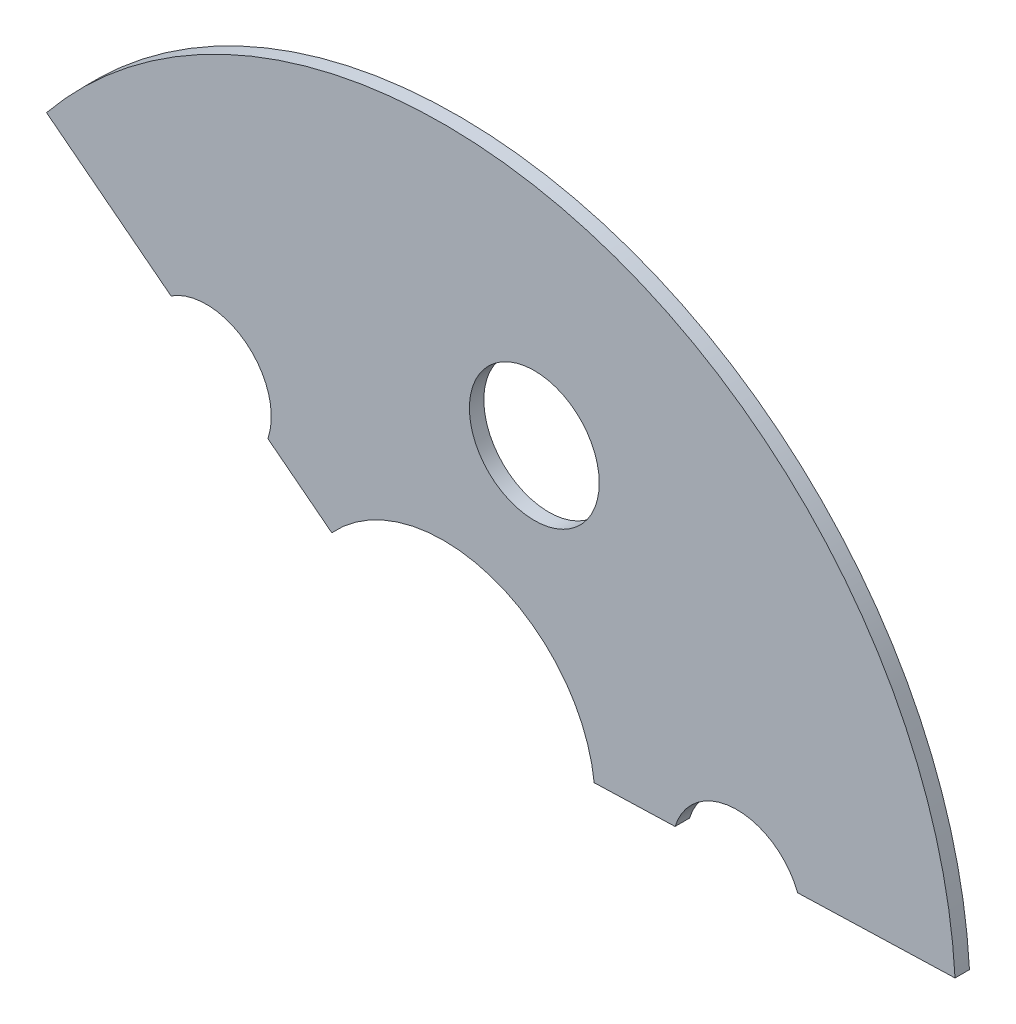
ISO-10303-21;
HEADER;
FILE_DESCRIPTION(('STEP AP214'),'2;1');
FILE_NAME('part.step','',(''),(''),'','','');
FILE_SCHEMA(('AUTOMOTIVE_DESIGN { 1 0 10303 214 1 1 1 1 }'));
ENDSEC;
DATA;
#1=APPLICATION_CONTEXT('core data for automotive mechanical design processes');
#2=APPLICATION_PROTOCOL_DEFINITION('international standard','automotive_design',2000,#1);
#3=PRODUCT_CONTEXT('',#1,'mechanical');
#4=PRODUCT('Part','Part','',(#3));
#5=PRODUCT_RELATED_PRODUCT_CATEGORY('part','',(#4));
#6=PRODUCT_DEFINITION_FORMATION('','',#4);
#7=PRODUCT_DEFINITION_CONTEXT('part definition',#1,'design');
#8=PRODUCT_DEFINITION('design','',#6,#7);
#9=PRODUCT_DEFINITION_SHAPE('','',#8);
#10=(LENGTH_UNIT() NAMED_UNIT(*) SI_UNIT(.MILLI.,.METRE.));
#11=(NAMED_UNIT(*) PLANE_ANGLE_UNIT() SI_UNIT($,.RADIAN.));
#12=(NAMED_UNIT(*) SI_UNIT($,.STERADIAN.) SOLID_ANGLE_UNIT());
#13=UNCERTAINTY_MEASURE_WITH_UNIT(LENGTH_MEASURE(1.E-05),#10,'distance_accuracy_value','');
#14=(GEOMETRIC_REPRESENTATION_CONTEXT(3) GLOBAL_UNCERTAINTY_ASSIGNED_CONTEXT((#13)) GLOBAL_UNIT_ASSIGNED_CONTEXT((#10,
#11,#12)) REPRESENTATION_CONTEXT('',''));
#15=CARTESIAN_POINT('',(0.,0.,0.));
#16=DIRECTION('',(0.,0.,1.));
#17=DIRECTION('',(1.,0.,0.));
#18=AXIS2_PLACEMENT_3D('',#15,#16,#17);
#19=CARTESIAN_POINT('',(45.0166893192371,2.48090865113747,1.27));
#20=DIRECTION('',(-0.0313182896172945,0.999509462053985,0.));
#21=DIRECTION('',(-0.999509462053985,-0.0313182896172945,0.));
#22=AXIS2_PLACEMENT_3D('',#19,#20,#21);
#23=PLANE('',#22);
#24=DIRECTION('',(0.,0.,1.));
#25=VECTOR('',#24,1.);
#26=CARTESIAN_POINT('',(20.3699099311103,1.70863484652068,0.));
#27=LINE('',#26,#25);
#28=CARTESIAN_POINT('',(20.3699099311102,1.70863484652068,0.));
#29=VERTEX_POINT('',#28);
#30=CARTESIAN_POINT('',(20.3699099311103,1.70863484652068,1.27));
#31=VERTEX_POINT('',#30);
#32=EDGE_CURVE('E55',#29,#31,#27,.T.);
#33=ORIENTED_EDGE('',*,*,#32,.T.);
#34=DIRECTION('',(0.999509462053985,0.0313182896172945,0.));
#35=VECTOR('',#34,1.);
#36=CARTESIAN_POINT('',(45.0166893192371,2.48090865113747,1.27));
#37=LINE('',#36,#35);
#38=CARTESIAN_POINT('',(13.2519887109247,1.48560432333908,1.27));
#39=VERTEX_POINT('',#38);
#40=EDGE_CURVE('E195',#39,#31,#37,.T.);
#41=ORIENTED_EDGE('',*,*,#40,.F.);
#42=DIRECTION('',(0.,0.,-1.));
#43=VECTOR('',#42,1.);
#44=CARTESIAN_POINT('',(13.2519887109247,1.48560432333908,1.27));
#45=LINE('',#44,#43);
#46=CARTESIAN_POINT('',(13.2519887109247,1.48560432333908,0.));
#47=VERTEX_POINT('',#46);
#48=EDGE_CURVE('E11',#39,#47,#45,.T.);
#49=ORIENTED_EDGE('',*,*,#48,.T.);
#50=DIRECTION('',(0.999509462053985,0.0313182896172945,0.));
#51=VECTOR('',#50,1.);
#52=CARTESIAN_POINT('',(45.0166893192371,2.48090865113747,0.));
#53=LINE('',#52,#51);
#54=EDGE_CURVE('E134',#47,#29,#53,.T.);
#55=ORIENTED_EDGE('',*,*,#54,.T.);
#56=EDGE_LOOP('',(#33,#41,#49,#55));
#57=FACE_BOUND('',#56,.T.);
#58=ADVANCED_FACE('F39',(#57),#23,.F.);
#59=DIRECTION('',(0.,0.,1.));
#60=VECTOR('',#59,1.);
#61=CARTESIAN_POINT('',(31.159448366082,2.04671057503752,0.));
#62=LINE('',#61,#60);
#63=CARTESIAN_POINT('',(31.159448366082,2.04671057503752,0.));
#64=VERTEX_POINT('',#63);
#65=CARTESIAN_POINT('',(31.159448366082,2.04671057503752,1.27));
#66=VERTEX_POINT('',#65);
#67=EDGE_CURVE('E176',#64,#66,#62,.T.);
#68=ORIENTED_EDGE('',*,*,#67,.F.);
#69=CARTESIAN_POINT('',(45.0166893192371,2.48090865113747,0.));
#70=VERTEX_POINT('',#69);
#71=EDGE_CURVE('E157',#64,#70,#53,.T.);
#72=ORIENTED_EDGE('',*,*,#71,.T.);
#73=DIRECTION('',(0.,0.,-1.));
#74=VECTOR('',#73,1.);
#75=CARTESIAN_POINT('',(45.0166893192371,2.48090865113747,1.27));
#76=LINE('',#75,#74);
#77=CARTESIAN_POINT('',(45.0166893192371,2.48090865113747,1.27));
#78=VERTEX_POINT('',#77);
#79=EDGE_CURVE('E48',#78,#70,#76,.T.);
#80=ORIENTED_EDGE('',*,*,#79,.F.);
#81=EDGE_CURVE('E177',#66,#78,#37,.T.);
#82=ORIENTED_EDGE('',*,*,#81,.F.);
#83=EDGE_LOOP('',(#68,#72,#80,#82));
#84=FACE_BOUND('',#83,.T.);
#85=ADVANCED_FACE('F175',(#84),#23,.F.);
#86=CARTESIAN_POINT('',(-34.9610251723369,28.4672433491412,1.27));
#87=DIRECTION('',(0.612833949857254,0.790211712076173,0.));
#88=DIRECTION('',(-0.790211712076173,0.612833949857254,0.));
#89=AXIS2_PLACEMENT_3D('',#86,#87,#88);
#90=PLANE('',#89);
#91=DIRECTION('',(0.,0.,1.));
#92=VECTOR('',#91,1.);
#93=CARTESIAN_POINT('',(-24.0054969717913,19.9708878569238,0.));
#94=LINE('',#93,#92);
#95=CARTESIAN_POINT('',(-24.0054969717913,19.9708878569238,0.));
#96=VERTEX_POINT('',#95);
#97=CARTESIAN_POINT('',(-24.0054969717913,19.9708878569238,1.27));
#98=VERTEX_POINT('',#97);
#99=EDGE_CURVE('E63',#96,#98,#94,.T.);
#100=ORIENTED_EDGE('',*,*,#99,.T.);
#101=DIRECTION('',(0.790211712076173,-0.612833949857254,0.));
#102=VECTOR('',#101,1.);
#103=CARTESIAN_POINT('',(-34.9610251723369,28.4672433491412,1.27));
#104=LINE('',#103,#102);
#105=CARTESIAN_POINT('',(-34.9610251723369,28.4672433491412,1.27));
#106=VERTEX_POINT('',#105);
#107=EDGE_CURVE('E142',#106,#98,#104,.T.);
#108=ORIENTED_EDGE('',*,*,#107,.F.);
#109=DIRECTION('',(0.,0.,-1.));
#110=VECTOR('',#109,1.);
#111=CARTESIAN_POINT('',(-34.9610251723369,28.4672433491412,1.27));
#112=LINE('',#111,#110);
#113=CARTESIAN_POINT('',(-34.9610251723369,28.4672433491412,0.));
#114=VERTEX_POINT('',#113);
#115=EDGE_CURVE('E141',#106,#114,#112,.T.);
#116=ORIENTED_EDGE('',*,*,#115,.T.);
#117=DIRECTION('',(0.790211712076173,-0.612833949857254,0.));
#118=VECTOR('',#117,1.);
#119=CARTESIAN_POINT('',(-34.9610251723369,28.4672433491412,0.));
#120=LINE('',#119,#118);
#121=EDGE_CURVE('E128',#114,#96,#120,.T.);
#122=ORIENTED_EDGE('',*,*,#121,.T.);
#123=EDGE_LOOP('',(#100,#108,#116,#122));
#124=FACE_BOUND('',#123,.T.);
#125=ADVANCED_FACE('F159',(#124),#90,.F.);
#126=DIRECTION('',(0.,0.,1.));
#127=VECTOR('',#126,1.);
#128=CARTESIAN_POINT('',(-15.4752929438175,13.3554472760488,0.));
#129=LINE('',#128,#127);
#130=CARTESIAN_POINT('',(-15.4752929438175,13.3554472760488,0.));
#131=VERTEX_POINT('',#130);
#132=CARTESIAN_POINT('',(-15.4752929438175,13.3554472760488,1.27));
#133=VERTEX_POINT('',#132);
#134=EDGE_CURVE('E105',#131,#133,#129,.T.);
#135=ORIENTED_EDGE('',*,*,#134,.F.);
#136=CARTESIAN_POINT('',(-9.84786776440252,8.99120267232597,0.));
#137=VERTEX_POINT('',#136);
#138=EDGE_CURVE('E118',#131,#137,#120,.T.);
#139=ORIENTED_EDGE('',*,*,#138,.T.);
#140=DIRECTION('',(0.,0.,-1.));
#141=VECTOR('',#140,1.);
#142=CARTESIAN_POINT('',(-9.84786776440252,8.99120267232597,1.27));
#143=LINE('',#142,#141);
#144=CARTESIAN_POINT('',(-9.84786776440252,8.99120267232597,1.27));
#145=VERTEX_POINT('',#144);
#146=EDGE_CURVE('E138',#145,#137,#143,.T.);
#147=ORIENTED_EDGE('',*,*,#146,.F.);
#148=EDGE_CURVE('E120',#133,#145,#104,.T.);
#149=ORIENTED_EDGE('',*,*,#148,.F.);
#150=EDGE_LOOP('',(#135,#139,#147,#149));
#151=FACE_BOUND('',#150,.T.);
#152=ADVANCED_FACE('F116',(#151),#90,.F.);
#153=CARTESIAN_POINT('',(0.,0.,1.27));
#154=DIRECTION('',(0.,0.,1.));
#155=DIRECTION('',(1.,0.,0.));
#156=AXIS2_PLACEMENT_3D('',#153,#154,#155);
#157=PLANE('',#156);
#158=CARTESIAN_POINT('',(7.97990452808554,24.55962079432,1.27));
#159=DIRECTION('',(0.,0.,1.));
#160=DIRECTION('',(1.,0.,0.));
#161=AXIS2_PLACEMENT_3D('',#158,#159,#160);
#162=CIRCLE('',#161,5.715);
#163=CARTESIAN_POINT('',(13.6949045280855,24.55962079432,1.27));
#164=VERTEX_POINT('',#163);
#165=EDGE_CURVE('E180',#164,#164,#162,.T.);
#166=ORIENTED_EDGE('',*,*,#165,.F.);
#167=EDGE_LOOP('',(#166));
#168=FACE_BOUND('',#167,.T.);
#169=ORIENTED_EDGE('',*,*,#107,.T.);
#170=CARTESIAN_POINT('',(-20.8916612815077,15.1786804016986,1.27));
#171=DIRECTION('',(0.,0.,1.));
#172=DIRECTION('',(1.,0.,0.));
#173=AXIS2_PLACEMENT_3D('',#170,#171,#172);
#174=CIRCLE('',#173,5.715);
#175=EDGE_CURVE('E112',#98,#133,#174,.F.);
#176=ORIENTED_EDGE('',*,*,#175,.T.);
#177=ORIENTED_EDGE('',*,*,#148,.T.);
#178=CARTESIAN_POINT('',(0.,0.,1.27));
#179=DIRECTION('',(0.,0.,-1.));
#180=DIRECTION('',(1.,0.,0.));
#181=AXIS2_PLACEMENT_3D('',#178,#179,#180);
#182=CIRCLE('',#181,13.335);
#183=EDGE_CURVE('E133',#145,#39,#182,.T.);
#184=ORIENTED_EDGE('',*,*,#183,.T.);
#185=ORIENTED_EDGE('',*,*,#40,.T.);
#186=CARTESIAN_POINT('',(25.823513506844,3.33066907387547E-13,1.27));
#187=DIRECTION('',(0.,0.,1.));
#188=DIRECTION('',(1.,0.,0.));
#189=AXIS2_PLACEMENT_3D('',#186,#187,#188);
#190=CIRCLE('',#189,5.715);
#191=EDGE_CURVE('E190',#31,#66,#190,.F.);
#192=ORIENTED_EDGE('',*,*,#191,.T.);
#193=ORIENTED_EDGE('',*,*,#81,.T.);
#194=CARTESIAN_POINT('',(0.,0.,1.27));
#195=DIRECTION('',(0.,0.,1.));
#196=DIRECTION('',(1.,0.,0.));
#197=AXIS2_PLACEMENT_3D('',#194,#195,#196);
#198=CIRCLE('',#197,45.085);
#199=EDGE_CURVE('E153',#78,#106,#198,.T.);
#200=ORIENTED_EDGE('',*,*,#199,.T.);
#201=EDGE_LOOP('',(#169,#176,#177,#184,#185,#192,#193,#200));
#202=FACE_BOUND('',#201,.T.);
#203=ADVANCED_FACE('F200',(#168,#202),#157,.T.);
#204=CARTESIAN_POINT('',(0.,0.,0.));
#205=DIRECTION('',(0.,0.,1.));
#206=DIRECTION('',(1.,0.,0.));
#207=AXIS2_PLACEMENT_3D('',#204,#205,#206);
#208=PLANE('',#207);
#209=CARTESIAN_POINT('',(7.97990452808554,24.55962079432,0.));
#210=DIRECTION('',(0.,0.,1.));
#211=DIRECTION('',(1.,0.,0.));
#212=AXIS2_PLACEMENT_3D('',#209,#210,#211);
#213=CIRCLE('',#212,5.715);
#214=CARTESIAN_POINT('',(13.6949045280855,24.55962079432,0.));
#215=VERTEX_POINT('',#214);
#216=EDGE_CURVE('E185',#215,#215,#213,.T.);
#217=ORIENTED_EDGE('',*,*,#216,.T.);
#218=EDGE_LOOP('',(#217));
#219=FACE_BOUND('',#218,.T.);
#220=CARTESIAN_POINT('',(-20.8916612815077,15.1786804016986,0.));
#221=DIRECTION('',(0.,0.,1.));
#222=DIRECTION('',(1.,0.,0.));
#223=AXIS2_PLACEMENT_3D('',#220,#221,#222);
#224=CIRCLE('',#223,5.715);
#225=EDGE_CURVE('E102',#96,#131,#224,.F.);
#226=ORIENTED_EDGE('',*,*,#225,.F.);
#227=ORIENTED_EDGE('',*,*,#121,.F.);
#228=CARTESIAN_POINT('',(0.,0.,0.));
#229=DIRECTION('',(0.,0.,1.));
#230=DIRECTION('',(1.,0.,0.));
#231=AXIS2_PLACEMENT_3D('',#228,#229,#230);
#232=CIRCLE('',#231,45.085);
#233=EDGE_CURVE('E129',#70,#114,#232,.T.);
#234=ORIENTED_EDGE('',*,*,#233,.F.);
#235=ORIENTED_EDGE('',*,*,#71,.F.);
#236=CARTESIAN_POINT('',(25.823513506844,3.33066907387547E-13,0.));
#237=DIRECTION('',(0.,0.,1.));
#238=DIRECTION('',(1.,0.,0.));
#239=AXIS2_PLACEMENT_3D('',#236,#237,#238);
#240=CIRCLE('',#239,5.715);
#241=EDGE_CURVE('E187',#29,#64,#240,.F.);
#242=ORIENTED_EDGE('',*,*,#241,.F.);
#243=ORIENTED_EDGE('',*,*,#54,.F.);
#244=CARTESIAN_POINT('',(0.,0.,0.));
#245=DIRECTION('',(0.,0.,-1.));
#246=DIRECTION('',(1.,0.,0.));
#247=AXIS2_PLACEMENT_3D('',#244,#245,#246);
#248=CIRCLE('',#247,13.335);
#249=EDGE_CURVE('E122',#137,#47,#248,.T.);
#250=ORIENTED_EDGE('',*,*,#249,.F.);
#251=ORIENTED_EDGE('',*,*,#138,.F.);
#252=EDGE_LOOP('',(#226,#227,#234,#235,#242,#243,#250,#251));
#253=FACE_BOUND('',#252,.T.);
#254=ADVANCED_FACE('F125',(#219,#253),#208,.F.);
#255=CARTESIAN_POINT('',(0.,0.,1.27));
#256=DIRECTION('',(0.,0.,-1.));
#257=DIRECTION('',(-1.,0.,0.));
#258=AXIS2_PLACEMENT_3D('',#255,#256,#257);
#259=CYLINDRICAL_SURFACE('',#258,13.335);
#260=ORIENTED_EDGE('',*,*,#249,.T.);
#261=ORIENTED_EDGE('',*,*,#48,.F.);
#262=ORIENTED_EDGE('',*,*,#183,.F.);
#263=ORIENTED_EDGE('',*,*,#146,.T.);
#264=EDGE_LOOP('',(#260,#261,#262,#263));
#265=FACE_BOUND('',#264,.T.);
#266=ADVANCED_FACE('F41',(#265),#259,.F.);
#267=CARTESIAN_POINT('',(0.,0.,1.27));
#268=DIRECTION('',(0.,0.,-1.));
#269=DIRECTION('',(-1.,0.,0.));
#270=AXIS2_PLACEMENT_3D('',#267,#268,#269);
#271=CYLINDRICAL_SURFACE('',#270,45.085);
#272=ORIENTED_EDGE('',*,*,#233,.T.);
#273=ORIENTED_EDGE('',*,*,#115,.F.);
#274=ORIENTED_EDGE('',*,*,#199,.F.);
#275=ORIENTED_EDGE('',*,*,#79,.T.);
#276=EDGE_LOOP('',(#272,#273,#274,#275));
#277=FACE_BOUND('',#276,.T.);
#278=ADVANCED_FACE('F151',(#277),#271,.T.);
#279=CARTESIAN_POINT('',(25.823513506844,3.33066907387547E-13,0.));
#280=DIRECTION('',(0.,0.,1.));
#281=DIRECTION('',(1.,0.,0.));
#282=AXIS2_PLACEMENT_3D('',#279,#280,#281);
#283=CYLINDRICAL_SURFACE('',#282,5.715);
#284=ORIENTED_EDGE('',*,*,#191,.F.);
#285=ORIENTED_EDGE('',*,*,#32,.F.);
#286=ORIENTED_EDGE('',*,*,#241,.T.);
#287=ORIENTED_EDGE('',*,*,#67,.T.);
#288=EDGE_LOOP('',(#284,#285,#286,#287));
#289=FACE_BOUND('',#288,.T.);
#290=ADVANCED_FACE('F220',(#289),#283,.F.);
#291=CARTESIAN_POINT('',(7.97990452808554,24.55962079432,0.));
#292=DIRECTION('',(0.,0.,1.));
#293=DIRECTION('',(1.,0.,0.));
#294=AXIS2_PLACEMENT_3D('',#291,#292,#293);
#295=CYLINDRICAL_SURFACE('',#294,5.715);
#296=ORIENTED_EDGE('',*,*,#216,.F.);
#297=EDGE_LOOP('',(#296));
#298=FACE_BOUND('',#297,.T.);
#299=ORIENTED_EDGE('',*,*,#165,.T.);
#300=EDGE_LOOP('',(#299));
#301=FACE_BOUND('',#300,.T.);
#302=ADVANCED_FACE('F231',(#298,#301),#295,.F.);
#303=CARTESIAN_POINT('',(-20.8916612815077,15.1786804016986,0.));
#304=DIRECTION('',(0.,0.,1.));
#305=DIRECTION('',(1.,0.,0.));
#306=AXIS2_PLACEMENT_3D('',#303,#304,#305);
#307=CYLINDRICAL_SURFACE('',#306,5.715);
#308=ORIENTED_EDGE('',*,*,#175,.F.);
#309=ORIENTED_EDGE('',*,*,#99,.F.);
#310=ORIENTED_EDGE('',*,*,#225,.T.);
#311=ORIENTED_EDGE('',*,*,#134,.T.);
#312=EDGE_LOOP('',(#308,#309,#310,#311));
#313=FACE_BOUND('',#312,.T.);
#314=ADVANCED_FACE('F104',(#313),#307,.F.);
#315=CLOSED_SHELL('',(#58,#85,#125,#152,#203,#254,#266,#278,#290,#302,#314));
#316=MANIFOLD_SOLID_BREP('B2',#315);
#317=ADVANCED_BREP_SHAPE_REPRESENTATION('',(#18,#316),#14);
#318=SHAPE_DEFINITION_REPRESENTATION(#9,#317);
ENDSEC;
END-ISO-10303-21;
